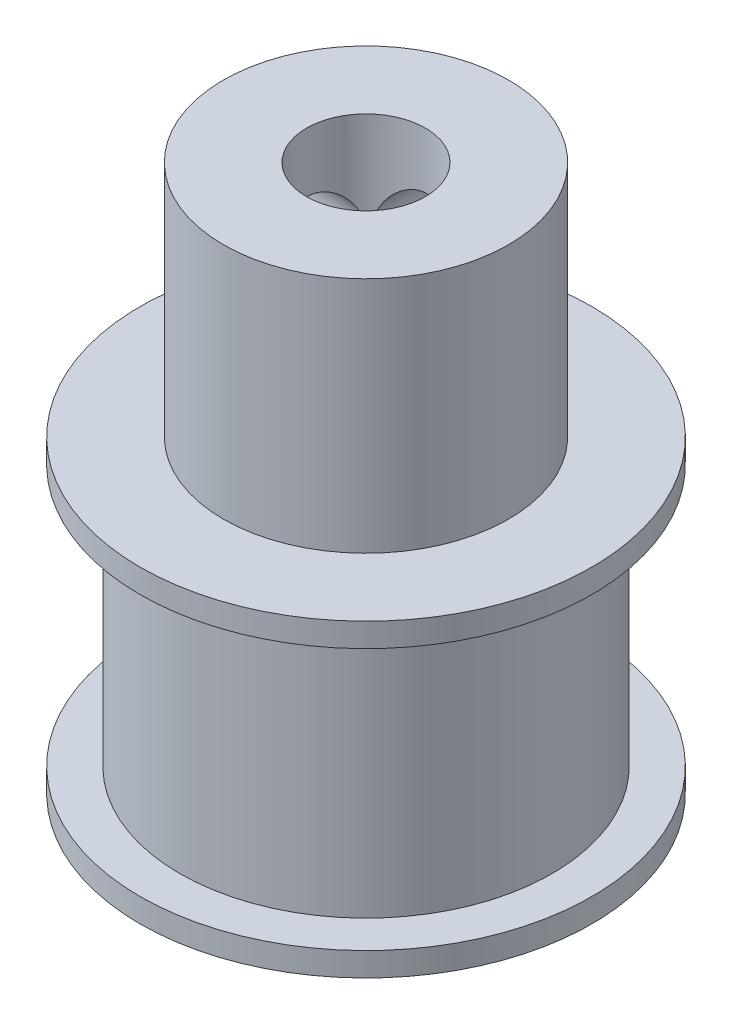
ISO-10303-21;
HEADER;
FILE_DESCRIPTION(('STEP AP214'),'2;1');
FILE_NAME('part.step','',(''),(''),'','','');
FILE_SCHEMA(('AUTOMOTIVE_DESIGN { 1 0 10303 214 1 1 1 1 }'));
ENDSEC;
DATA;
#1=APPLICATION_CONTEXT('core data for automotive mechanical design processes');
#2=APPLICATION_PROTOCOL_DEFINITION('international standard','automotive_design',2000,#1);
#3=PRODUCT_CONTEXT('',#1,'mechanical');
#4=PRODUCT('Part','Part','',(#3));
#5=PRODUCT_RELATED_PRODUCT_CATEGORY('part','',(#4));
#6=PRODUCT_DEFINITION_FORMATION('','',#4);
#7=PRODUCT_DEFINITION_CONTEXT('part definition',#1,'design');
#8=PRODUCT_DEFINITION('design','',#6,#7);
#9=PRODUCT_DEFINITION_SHAPE('','',#8);
#10=(LENGTH_UNIT() NAMED_UNIT(*) SI_UNIT(.MILLI.,.METRE.));
#11=(NAMED_UNIT(*) PLANE_ANGLE_UNIT() SI_UNIT($,.RADIAN.));
#12=(NAMED_UNIT(*) SI_UNIT($,.STERADIAN.) SOLID_ANGLE_UNIT());
#13=UNCERTAINTY_MEASURE_WITH_UNIT(LENGTH_MEASURE(1.E-05),#10,'distance_accuracy_value','');
#14=(GEOMETRIC_REPRESENTATION_CONTEXT(3) GLOBAL_UNCERTAINTY_ASSIGNED_CONTEXT((#13)) GLOBAL_UNIT_ASSIGNED_CONTEXT((#10,
#11,#12)) REPRESENTATION_CONTEXT('',''));
#15=CARTESIAN_POINT('',(0.,0.,0.));
#16=DIRECTION('',(0.,0.,1.));
#17=DIRECTION('',(1.,0.,0.));
#18=AXIS2_PLACEMENT_3D('',#15,#16,#17);
#19=CARTESIAN_POINT('',(0.,1.,0.));
#20=DIRECTION('',(0.,-1.,0.));
#21=DIRECTION('',(0.,0.,-1.));
#22=AXIS2_PLACEMENT_3D('',#19,#20,#21);
#23=CYLINDRICAL_SURFACE('',#22,9.5);
#24=CARTESIAN_POINT('',(0.,1.,0.));
#25=DIRECTION('',(0.,1.,0.));
#26=DIRECTION('',(0.,0.,1.));
#27=AXIS2_PLACEMENT_3D('',#24,#25,#26);
#28=CIRCLE('',#27,9.5);
#29=CARTESIAN_POINT('',(0.,1.,9.5));
#30=VERTEX_POINT('',#29);
#31=EDGE_CURVE('E46',#30,#30,#28,.T.);
#32=ORIENTED_EDGE('',*,*,#31,.F.);
#33=EDGE_LOOP('',(#32));
#34=FACE_BOUND('',#33,.T.);
#35=CARTESIAN_POINT('',(0.,0.,0.));
#36=DIRECTION('',(0.,1.,0.));
#37=DIRECTION('',(0.,0.,1.));
#38=AXIS2_PLACEMENT_3D('',#35,#36,#37);
#39=CIRCLE('',#38,9.5);
#40=CARTESIAN_POINT('',(0.,0.,9.5));
#41=VERTEX_POINT('',#40);
#42=EDGE_CURVE('E37',#41,#41,#39,.T.);
#43=ORIENTED_EDGE('',*,*,#42,.T.);
#44=EDGE_LOOP('',(#43));
#45=FACE_BOUND('',#44,.T.);
#46=ADVANCED_FACE('F34',(#34,#45),#23,.T.);
#47=CARTESIAN_POINT('',(0.,1.,0.));
#48=DIRECTION('',(0.,1.,0.));
#49=DIRECTION('',(0.,0.,1.));
#50=AXIS2_PLACEMENT_3D('',#47,#48,#49);
#51=PLANE('',#50);
#52=CARTESIAN_POINT('',(0.,1.,0.));
#53=DIRECTION('',(0.,1.,0.));
#54=DIRECTION('',(0.,0.,1.));
#55=AXIS2_PLACEMENT_3D('',#52,#53,#54);
#56=CIRCLE('',#55,7.83);
#57=CARTESIAN_POINT('',(0.,1.,7.83));
#58=VERTEX_POINT('',#57);
#59=EDGE_CURVE('E41',#58,#58,#56,.T.);
#60=ORIENTED_EDGE('',*,*,#59,.F.);
#61=EDGE_LOOP('',(#60));
#62=FACE_BOUND('',#61,.T.);
#63=ORIENTED_EDGE('',*,*,#31,.T.);
#64=EDGE_LOOP('',(#63));
#65=FACE_BOUND('',#64,.T.);
#66=ADVANCED_FACE('F70',(#62,#65),#51,.T.);
#67=CARTESIAN_POINT('',(0.,0.,0.));
#68=DIRECTION('',(0.,1.,0.));
#69=DIRECTION('',(0.,0.,1.));
#70=AXIS2_PLACEMENT_3D('',#67,#68,#69);
#71=PLANE('',#70);
#72=CARTESIAN_POINT('',(0.,0.,0.));
#73=DIRECTION('',(0.,1.,0.));
#74=DIRECTION('',(0.,0.,1.));
#75=AXIS2_PLACEMENT_3D('',#72,#73,#74);
#76=CIRCLE('',#75,2.5);
#77=CARTESIAN_POINT('',(0.,0.,2.5));
#78=VERTEX_POINT('',#77);
#79=EDGE_CURVE('E216',#78,#78,#76,.T.);
#80=ORIENTED_EDGE('',*,*,#79,.T.);
#81=EDGE_LOOP('',(#80));
#82=FACE_BOUND('',#81,.T.);
#83=ORIENTED_EDGE('',*,*,#42,.F.);
#84=EDGE_LOOP('',(#83));
#85=FACE_BOUND('',#84,.T.);
#86=ADVANCED_FACE('F67',(#82,#85),#71,.F.);
#87=CARTESIAN_POINT('',(0.,12.,0.));
#88=DIRECTION('',(0.,-1.,0.));
#89=DIRECTION('',(0.,0.,-1.));
#90=AXIS2_PLACEMENT_3D('',#87,#88,#89);
#91=CYLINDRICAL_SURFACE('',#90,7.83);
#92=CARTESIAN_POINT('',(0.,12.,0.));
#93=DIRECTION('',(0.,1.,0.));
#94=DIRECTION('',(0.,0.,1.));
#95=AXIS2_PLACEMENT_3D('',#92,#93,#94);
#96=CIRCLE('',#95,7.83);
#97=CARTESIAN_POINT('',(0.,12.,7.83));
#98=VERTEX_POINT('',#97);
#99=EDGE_CURVE('E55',#98,#98,#96,.T.);
#100=ORIENTED_EDGE('',*,*,#99,.F.);
#101=EDGE_LOOP('',(#100));
#102=FACE_BOUND('',#101,.T.);
#103=ORIENTED_EDGE('',*,*,#59,.T.);
#104=EDGE_LOOP('',(#103));
#105=FACE_BOUND('',#104,.T.);
#106=ADVANCED_FACE('F69',(#102,#105),#91,.T.);
#107=CARTESIAN_POINT('',(0.,13.,0.));
#108=DIRECTION('',(0.,-1.,0.));
#109=DIRECTION('',(0.,0.,-1.));
#110=AXIS2_PLACEMENT_3D('',#107,#108,#109);
#111=CYLINDRICAL_SURFACE('',#110,9.5);
#112=CARTESIAN_POINT('',(0.,13.,0.));
#113=DIRECTION('',(0.,1.,0.));
#114=DIRECTION('',(0.,0.,1.));
#115=AXIS2_PLACEMENT_3D('',#112,#113,#114);
#116=CIRCLE('',#115,9.5);
#117=CARTESIAN_POINT('',(0.,13.,9.5));
#118=VERTEX_POINT('',#117);
#119=EDGE_CURVE('E52',#118,#118,#116,.T.);
#120=ORIENTED_EDGE('',*,*,#119,.F.);
#121=EDGE_LOOP('',(#120));
#122=FACE_BOUND('',#121,.T.);
#123=CARTESIAN_POINT('',(0.,12.,0.));
#124=DIRECTION('',(0.,1.,0.));
#125=DIRECTION('',(0.,0.,1.));
#126=AXIS2_PLACEMENT_3D('',#123,#124,#125);
#127=CIRCLE('',#126,9.5);
#128=CARTESIAN_POINT('',(0.,12.,9.5));
#129=VERTEX_POINT('',#128);
#130=EDGE_CURVE('E56',#129,#129,#127,.T.);
#131=ORIENTED_EDGE('',*,*,#130,.T.);
#132=EDGE_LOOP('',(#131));
#133=FACE_BOUND('',#132,.T.);
#134=ADVANCED_FACE('F76',(#122,#133),#111,.T.);
#135=CARTESIAN_POINT('',(0.,13.,0.));
#136=DIRECTION('',(0.,1.,0.));
#137=DIRECTION('',(0.,0.,1.));
#138=AXIS2_PLACEMENT_3D('',#135,#136,#137);
#139=PLANE('',#138);
#140=CARTESIAN_POINT('',(0.,13.,0.));
#141=DIRECTION('',(0.,1.,0.));
#142=DIRECTION('',(0.,0.,1.));
#143=AXIS2_PLACEMENT_3D('',#140,#141,#142);
#144=CIRCLE('',#143,6.);
#145=CARTESIAN_POINT('',(0.,13.,6.));
#146=VERTEX_POINT('',#145);
#147=EDGE_CURVE('E10',#146,#146,#144,.T.);
#148=ORIENTED_EDGE('',*,*,#147,.F.);
#149=EDGE_LOOP('',(#148));
#150=FACE_BOUND('',#149,.T.);
#151=ORIENTED_EDGE('',*,*,#119,.T.);
#152=EDGE_LOOP('',(#151));
#153=FACE_BOUND('',#152,.T.);
#154=ADVANCED_FACE('F106',(#150,#153),#139,.T.);
#155=CARTESIAN_POINT('',(0.,12.,0.));
#156=DIRECTION('',(0.,1.,0.));
#157=DIRECTION('',(0.,0.,1.));
#158=AXIS2_PLACEMENT_3D('',#155,#156,#157);
#159=PLANE('',#158);
#160=ORIENTED_EDGE('',*,*,#99,.T.);
#161=EDGE_LOOP('',(#160));
#162=FACE_BOUND('',#161,.T.);
#163=ORIENTED_EDGE('',*,*,#130,.F.);
#164=EDGE_LOOP('',(#163));
#165=FACE_BOUND('',#164,.T.);
#166=ADVANCED_FACE('F114',(#162,#165),#159,.F.);
#167=CARTESIAN_POINT('',(0.,23.,0.));
#168=DIRECTION('',(0.,-1.,0.));
#169=DIRECTION('',(0.,0.,-1.));
#170=AXIS2_PLACEMENT_3D('',#167,#168,#169);
#171=CYLINDRICAL_SURFACE('',#170,6.);
#172=CARTESIAN_POINT('',(0.,20.6301819833465,-6.));
#173=CARTESIAN_POINT('',(-0.0911767729636271,20.620837516161,-5.99999862450086));
#174=CARTESIAN_POINT('',(-0.181597990772712,20.6038843136385,-5.99790154128));
#175=CARTESIAN_POINT('',(-0.358274369531179,20.5553382919222,-5.98994805143825));
#176=CARTESIAN_POINT('',(-0.444527075881076,20.523736960519,-5.9840894581938));
#177=CARTESIAN_POINT('',(-0.610327814226774,20.4469728002719,-5.96945734431905));
#178=CARTESIAN_POINT('',(-0.689885862394956,20.4018307095298,-5.96068827899731));
#179=CARTESIAN_POINT('',(-0.840391805564457,20.2992696079768,-5.9413388701896));
#180=CARTESIAN_POINT('',(-0.911339248955944,20.2418499536669,-5.93075843177064));
#181=CARTESIAN_POINT('',(-1.0443669076903,20.1147761176064,-5.90880305097118));
#182=CARTESIAN_POINT('',(-1.10620486360571,20.0448702987881,-5.89741541226102));
#183=CARTESIAN_POINT('',(-1.21733076153562,19.8955786710185,-5.87548491866891));
#184=CARTESIAN_POINT('',(-1.26661811190076,19.8161924154081,-5.86494210362892));
#185=CARTESIAN_POINT('',(-1.35139021913615,19.6495914309898,-5.84599434585058));
#186=CARTESIAN_POINT('',(-1.38680318957688,19.5623387872335,-5.83760059794015));
#187=CARTESIAN_POINT('',(-1.44225072758902,19.3828360606759,-5.82415115549142));
#188=CARTESIAN_POINT('',(-1.46228938245534,19.2905873130865,-5.81909457381031));
#189=CARTESIAN_POINT('',(-1.48585754916021,19.106928373247,-5.81312059691616));
#190=CARTESIAN_POINT('',(-1.48990259315473,19.0155884168568,-5.81207398136034));
#191=CARTESIAN_POINT('',(-1.48275782117429,18.8335533579089,-5.81390082111054));
#192=CARTESIAN_POINT('',(-1.47156956872631,18.7428581901313,-5.81677387410662));
#193=CARTESIAN_POINT('',(-1.43472768553529,18.5664634040446,-5.82596792938268));
#194=CARTESIAN_POINT('',(-1.4093534238253,18.4807015605927,-5.83222226690519));
#195=CARTESIAN_POINT('',(-1.34517238320604,18.3146115686294,-5.84735767355752));
#196=CARTESIAN_POINT('',(-1.30636366373347,18.2342842071161,-5.85623912213793));
#197=CARTESIAN_POINT('',(-1.21533154788017,18.0791624595558,-5.87581330562497));
#198=CARTESIAN_POINT('',(-1.16280058006229,18.0045536670283,-5.88654534956682));
#199=CARTESIAN_POINT('',(-1.04625342139608,17.8649725331209,-5.90837221763611));
#200=CARTESIAN_POINT('',(-0.982234978004602,17.8000020862665,-5.91946711256432));
#201=CARTESIAN_POINT('',(-0.842267701521632,17.6795485031359,-5.94102165357712));
#202=CARTESIAN_POINT('',(-0.766018794540763,17.6244080936774,-5.95145229234943));
#203=CARTESIAN_POINT('',(-0.60510253889407,17.5276656614641,-5.96995812303221));
#204=CARTESIAN_POINT('',(-0.52043576216626,17.4860627197483,-5.97803347482224));
#205=CARTESIAN_POINT('',(-0.345889053139575,17.418043037718,-5.99065409581881));
#206=CARTESIAN_POINT('',(-0.256067052687507,17.3914841701219,-5.99523255038205));
#207=CARTESIAN_POINT('',(-0.073126924642099,17.3538683905214,-6.00025123857152));
#208=CARTESIAN_POINT('',(0.0199904226308959,17.3428078334513,-6.00069244538088));
#209=CARTESIAN_POINT('',(0.203630166213056,17.3366877220476,-5.99722415241113));
#210=CARTESIAN_POINT('',(0.294138662525541,17.3411203455968,-5.99345543531563));
#211=CARTESIAN_POINT('',(0.47295540745249,17.3647090605182,-5.98200141142317));
#212=CARTESIAN_POINT('',(0.561263723248721,17.3838647017578,-5.9743162243684));
#213=CARTESIAN_POINT('',(0.732707000531813,17.4360967721383,-5.95571478723632));
#214=CARTESIAN_POINT('',(0.815869577904955,17.4690898290683,-5.94481800244314));
#215=CARTESIAN_POINT('',(0.975465611562761,17.5479826353296,-5.92072531603867));
#216=CARTESIAN_POINT('',(1.05189796393209,17.5938844968499,-5.90752903830992));
#217=CARTESIAN_POINT('',(1.19827783819547,17.6988422690281,-5.8796128420035));
#218=CARTESIAN_POINT('',(1.26797369471656,17.7582403951918,-5.86485988281339));
#219=CARTESIAN_POINT('',(1.39656778663354,17.8878182838258,-5.83557680554217));
#220=CARTESIAN_POINT('',(1.4554641113788,17.9579999500884,-5.82104672730898));
#221=CARTESIAN_POINT('',(1.5621179287648,18.109047609722,-5.79334953214458));
#222=CARTESIAN_POINT('',(1.60959846293895,18.1901165642271,-5.78021992886271));
#223=CARTESIAN_POINT('',(1.69027776328975,18.3594951219738,-5.75714618730373));
#224=CARTESIAN_POINT('',(1.72347889993195,18.4478035205242,-5.74720152037814));
#225=CARTESIAN_POINT('',(1.77400227681874,18.6273523982865,-5.73180651336771));
#226=CARTESIAN_POINT('',(1.79162316750549,18.7185014058029,-5.7262718545265));
#227=CARTESIAN_POINT('',(1.81145687152056,18.9026154426822,-5.72002947953036));
#228=CARTESIAN_POINT('',(1.81367317027408,18.9955800564742,-5.71932067148474));
#229=CARTESIAN_POINT('',(1.80280626421198,19.1774834197769,-5.72275418004724));
#230=CARTESIAN_POINT('',(1.79021564012806,19.2664551215283,-5.72674031685868));
#231=CARTESIAN_POINT('',(1.75097153069946,19.4409414917706,-5.7388601227847));
#232=CARTESIAN_POINT('',(1.72431724443373,19.5264559630746,-5.74699402811249));
#233=CARTESIAN_POINT('',(1.65755765538125,19.6922968548768,-5.76660324252605));
#234=CARTESIAN_POINT('',(1.61736532332923,19.7725855918049,-5.77810010578938));
#235=CARTESIAN_POINT('',(1.52470176184769,19.9253643887062,-5.80323895466779));
#236=CARTESIAN_POINT('',(1.47222815646321,19.997852935676,-5.81688135519423));
#237=CARTESIAN_POINT('',(1.35429542810486,20.1356554829769,-5.84548410780753));
#238=CARTESIAN_POINT('',(1.2884466151692,20.2006302631555,-5.86047385583648));
#239=CARTESIAN_POINT('',(1.14667535462093,20.318660393753,-5.88985299023171));
#240=CARTESIAN_POINT('',(1.07075118775885,20.3717137057326,-5.90424227358316));
#241=CARTESIAN_POINT('',(0.909949229643914,20.4648658435635,-5.93116335543589));
#242=CARTESIAN_POINT('',(0.824987543881932,20.5048261285294,-5.94367457481583));
#243=CARTESIAN_POINT('',(0.649149281361857,20.5697198093998,-5.96543625081545));
#244=CARTESIAN_POINT('',(0.55827695588597,20.5946638762774,-5.97468902104125));
#245=CARTESIAN_POINT('',(0.38927411551167,20.6257460436327,-5.98785232412913));
#246=CARTESIAN_POINT('',(0.311644082651371,20.6343828687105,-5.99240841926791));
#247=CARTESIAN_POINT('',(0.155826726701991,20.6405790321267,-5.99848275039037));
#248=CARTESIAN_POINT('',(0.0776394378232258,20.638139044728,-6.00000117127396));
#249=CARTESIAN_POINT('',(0.,20.6301819833465,-6.));
#250=B_SPLINE_CURVE_WITH_KNOTS('',3,(#172,#173,#174,#175,#176,#177,#178,#179,#180,#181,#182,
#183,#184,#185,#186,#187,#188,#189,#190,#191,#192,#193,#194,#195,#196,#197,#198,#199,#200,#201,
#202,#203,#204,#205,#206,#207,#208,#209,#210,#211,#212,#213,#214,#215,#216,#217,#218,#219,#220,
#221,#222,#223,#224,#225,#226,#227,#228,#229,#230,#231,#232,#233,#234,#235,#236,#237,#238,#239,
#240,#241,#242,#243,#244,#245,#246,#247,#248,#249),.UNSPECIFIED.,.T.,.F.,(4,2,2,2,2,2,2,2,2,2,2,
2,2,2,2,2,2,2,2,2,2,2,2,2,2,2,2,2,2,2,2,2,2,2,2,2,2,2,4),(0.,0.274672979110037,
0.549505774586879,0.823919785588654,1.09834818286907,1.37910611701783,1.65987728395548,
1.94208256707264,2.22421279928586,2.49717100042524,2.77010118757969,3.03783675887706,
3.30561101984676,3.57999710958137,3.85443706173775,4.13710270948336,4.4197491650939,
4.69967879876516,4.97954258440227,5.2503204617167,5.52109006076203,5.79025115728031,
6.05945632063498,6.33645179969997,6.61349623755637,6.89670415085918,7.17986503178793,
7.45747248969806,7.73501713441954,8.003583920446,8.27216600291596,8.5425087051839,
8.8129037516824,9.09274744408554,9.37263895031986,9.65540300168123,9.93796587452869,
10.1718714314569,10.405762750377),.UNSPECIFIED.);
#251=CARTESIAN_POINT('',(0.,20.6301819833465,-6.));
#252=VERTEX_POINT('',#251);
#253=EDGE_CURVE('E198',#252,#252,#250,.T.);
#254=ORIENTED_EDGE('',*,*,#253,.T.);
#255=EDGE_LOOP('',(#254));
#256=FACE_BOUND('',#255,.T.);
#257=CARTESIAN_POINT('',(-5.84283231595858,18.8334761657231,1.36429854782231));
#258=CARTESIAN_POINT('',(-5.84283367618818,18.7426957190814,1.36429651591172));
#259=CARTESIAN_POINT('',(-5.84462631345508,18.6518949351074,1.3566836853668));
#260=CARTESIAN_POINT('',(-5.85154814083179,18.4729234580005,1.32650529935623));
#261=CARTESIAN_POINT('',(-5.85667886742528,18.3847539955898,1.30393285806648));
#262=CARTESIAN_POINT('',(-5.8695585320605,18.2136603785349,1.24466606570195));
#263=CARTESIAN_POINT('',(-5.8773036273039,18.1307287361196,1.20799243069407));
#264=CARTESIAN_POINT('',(-5.89438601800649,17.9721089475682,1.12166911003332));
#265=CARTESIAN_POINT('',(-5.90372346560178,17.8964214946343,1.0720181842659));
#266=CARTESIAN_POINT('',(-5.92301642208846,17.7524257034059,0.959785217779206));
#267=CARTESIAN_POINT('',(-5.93298139369016,17.6843385544951,0.896920955674683));
#268=CARTESIAN_POINT('',(-5.95197747004505,17.5594349639641,0.760713746800108));
#269=CARTESIAN_POINT('',(-5.96100847267227,17.5026197542652,0.687369656184455));
#270=CARTESIAN_POINT('',(-5.97700250138005,17.4009413619501,0.530782808800627));
#271=CARTESIAN_POINT('',(-5.98392748034313,17.356299429344,0.447392094727171));
#272=CARTESIAN_POINT('',(-5.99436397115927,17.2816800269484,0.274088264804776));
#273=CARTESIAN_POINT('',(-5.99787609674641,17.2516999210015,0.184176324795538));
#274=CARTESIAN_POINT('',(-6.00066843524779,17.2079749210405,0.00273061586605571));
#275=CARTESIAN_POINT('',(-6.0000493450816,17.1938534497064,-0.0887107459138302));
#276=CARTESIAN_POINT('',(-5.99451206527872,17.1810603670434,-0.272532351301434));
#277=CARTESIAN_POINT('',(-5.98959463922556,17.1823860121069,-0.36491242526959));
#278=CARTESIAN_POINT('',(-5.97583010748287,17.200187312114,-0.545371191962911));
#279=CARTESIAN_POINT('',(-5.96709187691199,17.2162558937064,-0.633498806324556));
#280=CARTESIAN_POINT('',(-5.94630585808424,17.2624275503162,-0.805582292590418));
#281=CARTESIAN_POINT('',(-5.93425787536135,17.2925314500577,-0.889537919025166));
#282=CARTESIAN_POINT('',(-5.9076450947981,17.3662223112698,-1.05193958677669));
#283=CARTESIAN_POINT('',(-5.89305547361465,17.409945965837,-1.13031940275437));
#284=CARTESIAN_POINT('',(-5.86265327049509,17.5095295573697,-1.27868701656677));
#285=CARTESIAN_POINT('',(-5.84684043767356,17.5653919883182,-1.34867308526431));
#286=CARTESIAN_POINT('',(-5.81482953539839,17.6898167770424,-1.48071882616018));
#287=CARTESIAN_POINT('',(-5.79863570729032,17.7587337113106,-1.54244581976323));
#288=CARTESIAN_POINT('',(-5.76792133531382,17.9061965876401,-1.65360771279139));
#289=CARTESIAN_POINT('',(-5.7534009073529,17.9847431959207,-1.703041761024));
#290=CARTESIAN_POINT('',(-5.72740389130101,18.1499932426422,-1.78853687896934));
#291=CARTESIAN_POINT('',(-5.71594905638418,18.2367493529869,-1.82450306440392));
#292=CARTESIAN_POINT('',(-5.69746993275193,18.4154977806279,-1.88142016761068));
#293=CARTESIAN_POINT('',(-5.69044446452216,18.5074886968061,-1.90237508299859));
#294=CARTESIAN_POINT('',(-5.68176990535243,18.6909725765182,-1.92812624539078));
#295=CARTESIAN_POINT('',(-5.67995756261582,18.7823890136588,-1.9334133052732));
#296=CARTESIAN_POINT('',(-5.68144371388677,18.964814696123,-1.92904200633784));
#297=CARTESIAN_POINT('',(-5.68474162437066,19.0558239867473,-1.91938535389554));
#298=CARTESIAN_POINT('',(-5.69596112930281,19.2328950443984,-1.88582230055918));
#299=CARTESIAN_POINT('',(-5.70378527418643,19.319020309001,-1.86221601106643));
#300=CARTESIAN_POINT('',(-5.7231762853817,19.4860278489386,-1.80173670757512));
#301=CARTESIAN_POINT('',(-5.73474366297283,19.5669094062353,-1.76486188118081));
#302=CARTESIAN_POINT('',(-5.76080275150937,19.7232042599032,-1.67787153247394));
#303=CARTESIAN_POINT('',(-5.77535603825252,19.7984473238445,-1.62746887976595));
#304=CARTESIAN_POINT('',(-5.80583237934673,19.939480528323,-1.51515340656867));
#305=CARTESIAN_POINT('',(-5.82175570778131,20.0052687703146,-1.45323828006295));
#306=CARTESIAN_POINT('',(-5.85403290247317,20.1276195207606,-1.3173147842623));
#307=CARTESIAN_POINT('',(-5.87038482737583,20.1838331507303,-1.24299123697883));
#308=CARTESIAN_POINT('',(-5.90151695861642,20.2828691961656,-1.08559810927949));
#309=CARTESIAN_POINT('',(-5.91629724842577,20.3256923230516,-1.00252899381801));
#310=CARTESIAN_POINT('',(-5.94287009962105,20.3963305790363,-0.830542302921581));
#311=CARTESIAN_POINT('',(-5.95468481633851,20.4242588666589,-0.74167475332684));
#312=CARTESIAN_POINT('',(-5.97449870073596,20.4646356826914,-0.560085832211164));
#313=CARTESIAN_POINT('',(-5.98249877168788,20.4770878768165,-0.467365378680167));
#314=CARTESIAN_POINT('',(-5.99395981756808,20.4859173561347,-0.283932572219289));
#315=CARTESIAN_POINT('',(-5.99756011965388,20.4828048979866,-0.193253148998172));
#316=CARTESIAN_POINT('',(-6.00065757541013,20.4617865839133,-0.0135611205478293));
#317=CARTESIAN_POINT('',(-6.00015490090782,20.4438813475183,0.0754515543261436));
#318=CARTESIAN_POINT('',(-5.99546872008123,20.3940814048346,0.248607506300531));
#319=CARTESIAN_POINT('',(-5.99131372521762,20.3622960176326,0.332783132155014));
#320=CARTESIAN_POINT('',(-5.98011552255743,20.2857353330913,0.494792706867527));
#321=CARTESIAN_POINT('',(-5.97307189053186,20.2409581280396,0.572625722228129));
#322=CARTESIAN_POINT('',(-5.95688103265632,20.1382241297367,0.722066472568171));
#323=CARTESIAN_POINT('',(-5.9476804064644,20.0799332764598,0.79343874283834));
#324=CARTESIAN_POINT('',(-5.92855365760995,19.9524524392834,0.925591350128466));
#325=CARTESIAN_POINT('',(-5.91862734062935,19.883259530371,0.986368835331326));
#326=CARTESIAN_POINT('',(-5.89913919757429,19.7339583605226,1.09699290768467));
#327=CARTESIAN_POINT('',(-5.88959166963214,19.653629502506,1.14654490298854));
#328=CARTESIAN_POINT('',(-5.87246657637435,19.4855505597042,1.23126624137537));
#329=CARTESIAN_POINT('',(-5.86488780211705,19.397805073295,1.26644441854974));
#330=CARTESIAN_POINT('',(-5.85369874410927,19.2309798335208,1.31710898751965));
#331=CARTESIAN_POINT('',(-5.84966319009149,19.1525799177043,1.33476043761754));
#332=CARTESIAN_POINT('',(-5.84422954831953,18.9939505253786,1.35835534568148));
#333=CARTESIAN_POINT('',(-5.84283111358739,18.9137212909675,1.36430034392407));
#334=CARTESIAN_POINT('',(-5.84283231595858,18.8334761657231,1.36429854782231));
#335=B_SPLINE_CURVE_WITH_KNOTS('',3,(#257,#258,#259,#260,#261,#262,#263,#264,#265,#266,#267,
#268,#269,#270,#271,#272,#273,#274,#275,#276,#277,#278,#279,#280,#281,#282,#283,#284,#285,#286,
#287,#288,#289,#290,#291,#292,#293,#294,#295,#296,#297,#298,#299,#300,#301,#302,#303,#304,#305,
#306,#307,#308,#309,#310,#311,#312,#313,#314,#315,#316,#317,#318,#319,#320,#321,#322,#323,#324,
#325,#326,#327,#328,#329,#330,#331,#332,#333,#334),.UNSPECIFIED.,.T.,.F.,(4,2,2,2,2,2,2,2,2,2,2,
2,2,2,2,2,2,2,2,2,2,2,2,2,2,2,2,2,2,2,2,2,2,2,2,2,2,2,4),(0.,0.272046051104012,
0.544217410515629,0.815990441281185,1.08778945227587,1.36612384486572,1.64448864015853,
1.92761862185042,2.21069767879603,2.48690242321262,2.76305811084345,3.03181099442101,
3.30057967207718,3.57213780160766,3.84375177719015,4.12421818647043,4.40470401050125,
4.68713031851457,4.9694813862591,5.24288876991941,5.5162649363549,5.78396348444837,
6.0516986123097,6.32564040616628,6.59963713140791,6.88212071608134,7.16458929021235,
7.44488018041166,7.72510466738726,7.9962039644357,8.26729190826139,8.53628224078239,
8.80531209172669,9.08187822938626,9.35851869627827,9.6417433998802,9.92479377192828,
10.1652997746179,10.4057741306125),.UNSPECIFIED.);
#336=CARTESIAN_POINT('',(-5.84283231595858,18.8334761657231,1.36429854782231));
#337=VERTEX_POINT('',#336);
#338=EDGE_CURVE('E210',#337,#337,#335,.T.);
#339=ORIENTED_EDGE('',*,*,#338,.T.);
#340=EDGE_LOOP('',(#339));
#341=FACE_BOUND('',#340,.T.);
#342=CARTESIAN_POINT('',(0.,23.,0.));
#343=DIRECTION('',(0.,1.,0.));
#344=DIRECTION('',(0.,0.,1.));
#345=AXIS2_PLACEMENT_3D('',#342,#343,#344);
#346=CIRCLE('',#345,6.);
#347=CARTESIAN_POINT('',(0.,23.,6.));
#348=VERTEX_POINT('',#347);
#349=EDGE_CURVE('E50',#348,#348,#346,.T.);
#350=ORIENTED_EDGE('',*,*,#349,.F.);
#351=EDGE_LOOP('',(#350));
#352=FACE_BOUND('',#351,.T.);
#353=ORIENTED_EDGE('',*,*,#147,.T.);
#354=EDGE_LOOP('',(#353));
#355=FACE_BOUND('',#354,.T.);
#356=ADVANCED_FACE('F119',(#256,#341,#352,#355),#171,.T.);
#357=CARTESIAN_POINT('',(0.,23.,0.));
#358=DIRECTION('',(0.,1.,0.));
#359=DIRECTION('',(0.,0.,1.));
#360=AXIS2_PLACEMENT_3D('',#357,#358,#359);
#361=PLANE('',#360);
#362=CARTESIAN_POINT('',(0.,23.,0.));
#363=DIRECTION('',(0.,1.,0.));
#364=DIRECTION('',(0.,0.,1.));
#365=AXIS2_PLACEMENT_3D('',#362,#363,#364);
#366=CIRCLE('',#365,2.5);
#367=CARTESIAN_POINT('',(0.,23.,2.5));
#368=VERTEX_POINT('',#367);
#369=EDGE_CURVE('E215',#368,#368,#366,.T.);
#370=ORIENTED_EDGE('',*,*,#369,.F.);
#371=EDGE_LOOP('',(#370));
#372=FACE_BOUND('',#371,.T.);
#373=ORIENTED_EDGE('',*,*,#349,.T.);
#374=EDGE_LOOP('',(#373));
#375=FACE_BOUND('',#374,.T.);
#376=ADVANCED_FACE('F137',(#372,#375),#361,.T.);
#377=CARTESIAN_POINT('',(0.,0.,0.));
#378=DIRECTION('',(0.,1.,0.));
#379=DIRECTION('',(0.,0.,1.));
#380=AXIS2_PLACEMENT_3D('',#377,#378,#379);
#381=CYLINDRICAL_SURFACE('',#380,2.5);
#382=CARTESIAN_POINT('',(-1.59668478918975,18.9887824422168,-1.92369376044371));
#383=CARTESIAN_POINT('',(-1.59667895373649,19.0695767187765,-1.92370317081926));
#384=CARTESIAN_POINT('',(-1.59055273152686,19.1504088112726,-1.92883401596511));
#385=CARTESIAN_POINT('',(-1.56657008294365,19.3092003928221,-1.94835252366168));
#386=CARTESIAN_POINT('',(-1.5486925947672,19.3871544581327,-1.96275680604541));
#387=CARTESIAN_POINT('',(-1.50263503786641,19.537415773799,-1.99822791281291));
#388=CARTESIAN_POINT('',(-1.47455252312807,19.609768873722,-2.01923140346138));
#389=CARTESIAN_POINT('',(-1.40921370611543,19.7487276895976,-2.06536066116545));
#390=CARTESIAN_POINT('',(-1.3719553961958,19.8153321434453,-2.09048732996203));
#391=CARTESIAN_POINT('',(-1.28279620026727,19.9519998090936,-2.14653379913367));
#392=CARTESIAN_POINT('',(-1.22953041838521,20.0210497187268,-2.17775360651913));
#393=CARTESIAN_POINT('',(-1.11277561447846,20.1502595883607,-2.2396667356343));
#394=CARTESIAN_POINT('',(-1.04927693060445,20.2104110425135,-2.27035952915156));
#395=CARTESIAN_POINT('',(-0.903178281725033,20.3285151584157,-2.3326856701172));
#396=CARTESIAN_POINT('',(-0.819148189818825,20.3849733458545,-2.36384603046538));
#397=CARTESIAN_POINT('',(-0.640345452803766,20.4826235965033,-2.41840013362841));
#398=CARTESIAN_POINT('',(-0.5455847163104,20.5238323704596,-2.44180237506567));
#399=CARTESIAN_POINT('',(-0.359085004741253,20.5848560544835,-2.4756863185182));
#400=CARTESIAN_POINT('',(-0.268168848654864,20.6065315917062,-2.48730985079045));
#401=CARTESIAN_POINT('',(-0.0833009117673833,20.6342725893333,-2.50032176101177));
#402=CARTESIAN_POINT('',(0.0106470112592685,20.6403571524605,-2.50172266804945));
#403=CARTESIAN_POINT('',(0.183734665061579,20.6367910668377,-2.49451605504825));
#404=CARTESIAN_POINT('',(0.262993283534873,20.6293517743036,-2.48736999327935));
#405=CARTESIAN_POINT('',(0.418651602366162,20.603319366795,-2.46594811172702));
#406=CARTESIAN_POINT('',(0.495051091821595,20.5847254307186,-2.45167176709095));
#407=CARTESIAN_POINT('',(0.642894531253384,20.5373677263441,-2.41711450395084));
#408=CARTESIAN_POINT('',(0.714351797465234,20.5086326694452,-2.39685056353564));
#409=CARTESIAN_POINT('',(0.851296818136746,20.442100338145,-2.35170125943634));
#410=CARTESIAN_POINT('',(0.916783442344458,20.4043013528237,-2.32681502344127));
#411=CARTESIAN_POINT('',(1.04912747668603,20.3152306338519,-2.27049627991255));
#412=CARTESIAN_POINT('',(1.11504987400038,20.2628447435956,-2.23863330733648));
#413=CARTESIAN_POINT('',(1.23768711658329,20.1489726699752,-2.17324029598978));
#414=CARTESIAN_POINT('',(1.2943875344393,20.087472509551,-2.13970775026252));
#415=CARTESIAN_POINT('',(1.40580590483592,19.946289344791,-2.06850311529047));
#416=CARTESIAN_POINT('',(1.4589250067673,19.8652631397917,-2.03097262332433));
#417=CARTESIAN_POINT('',(1.55086993527023,19.6932526650521,-1.96166239485673));
#418=CARTESIAN_POINT('',(1.58972032759731,19.6022858633583,-1.92987282292132));
#419=CARTESIAN_POINT('',(1.64256708799151,19.4388314540164,-1.8848933745894));
#420=CARTESIAN_POINT('',(1.66048263987955,19.3683655041575,-1.86898644361619));
#421=CARTESIAN_POINT('',(1.68711473353296,19.2244672804577,-1.84498606522134));
#422=CARTESIAN_POINT('',(1.69584667714016,19.1510401882477,-1.83687953768215));
#423=CARTESIAN_POINT('',(1.7035884289112,19.0029214232521,-1.82970484052702));
#424=CARTESIAN_POINT('',(1.70255965572139,18.9282258980371,-1.83067253858342));
#425=CARTESIAN_POINT('',(1.69076023645979,18.7802491500696,-1.84157202000062));
#426=CARTESIAN_POINT('',(1.67998156619054,18.7069691430389,-1.8515111868956));
#427=CARTESIAN_POINT('',(1.65002397188496,18.5669385121643,-1.87824280332239));
#428=CARTESIAN_POINT('',(1.6312270628674,18.5000425989149,-1.89472146160963));
#429=CARTESIAN_POINT('',(1.58609534072321,18.3703706525232,-1.93265839468119));
#430=CARTESIAN_POINT('',(1.55975802797883,18.3075959940597,-1.95411832029121));
#431=CARTESIAN_POINT('',(1.49424895132653,18.174628975928,-2.00480775731465));
#432=CARTESIAN_POINT('',(1.45356580993205,18.1054487198346,-2.03473348104102));
#433=CARTESIAN_POINT('',(1.36302579630216,17.9742364458004,-2.09646631521701));
#434=CARTESIAN_POINT('',(1.31315776190212,17.9122132764866,-2.12827568254778));
#435=CARTESIAN_POINT('',(1.19343159682318,17.7838052353112,-2.19805989702854));
#436=CARTESIAN_POINT('',(1.12157353757915,17.7192106979115,-2.23593627841606));
#437=CARTESIAN_POINT('',(0.96611077977832,17.6030753870585,-2.30736364834808));
#438=CARTESIAN_POINT('',(0.882517296888429,17.5515222800672,-2.3409187087926));
#439=CARTESIAN_POINT('',(0.722452316991735,17.472245404185,-2.39452231881535));
#440=CARTESIAN_POINT('',(0.647767757989632,17.4418356483815,-2.41592865829431));
#441=CARTESIAN_POINT('',(0.493261039517441,17.3921901422597,-2.45213597875242));
#442=CARTESIAN_POINT('',(0.413443244472778,17.3729450353839,-2.46694248831476));
#443=CARTESIAN_POINT('',(0.250419719705409,17.3465902340954,-2.48879015573447));
#444=CARTESIAN_POINT('',(0.167201398779494,17.3395308092,-2.49579910433303));
#445=CARTESIAN_POINT('',(0.000372403229287392,17.338147659475,-2.5013920088034));
#446=CARTESIAN_POINT('',(-0.0832382533668573,17.3438233550656,-2.4999763480773));
#447=CARTESIAN_POINT('',(-0.242537864657401,17.3667419239701,-2.4894022756539));
#448=CARTESIAN_POINT('',(-0.31838127752214,17.3831807101902,-2.4807713045935));
#449=CARTESIAN_POINT('',(-0.466168300288907,17.4260086057417,-2.45729329214929));
#450=CARTESIAN_POINT('',(-0.538111295299078,17.4523992787781,-2.44244527386225));
#451=CARTESIAN_POINT('',(-0.681082092630777,17.5160394094054,-2.40663586805096));
#452=CARTESIAN_POINT('',(-0.751769114628915,17.5538663953976,-2.38534930086207));
#453=CARTESIAN_POINT('',(-0.886166199390949,17.6383900263587,-2.33875568511801));
#454=CARTESIAN_POINT('',(-0.949871711504959,17.6850924028564,-2.31344604028654));
#455=CARTESIAN_POINT('',(-1.07901371650788,17.7943115173694,-2.25642570624471));
#456=CARTESIAN_POINT('',(-1.1431563991287,17.8581596439642,-2.22433351387328));
#457=CARTESIAN_POINT('',(-1.26039202426596,17.9953507826583,-2.16006553021151));
#458=CARTESIAN_POINT('',(-1.31347778720476,18.0686999142182,-2.12788969825336));
#459=CARTESIAN_POINT('',(-1.40304927809158,18.2167556441994,-2.06978925250414));
#460=CARTESIAN_POINT('',(-1.44063030202664,18.2906773999813,-2.04356122000155));
#461=CARTESIAN_POINT('',(-1.50458569449405,18.4448915751001,-1.99694650730319));
#462=CARTESIAN_POINT('',(-1.53098397320873,18.5251699621099,-1.97654739483748));
#463=CARTESIAN_POINT('',(-1.56601504550108,18.6694738390305,-1.94883638462958));
#464=CARTESIAN_POINT('',(-1.57746050577655,18.7324293498237,-1.93951431337351));
#465=CARTESIAN_POINT('',(-1.59279567263886,18.8598432440392,-1.92694087998194));
#466=CARTESIAN_POINT('',(-1.59668944644554,18.924300799541,-1.92368625005438));
#467=CARTESIAN_POINT('',(-1.59668478918975,18.9887824422168,-1.92369376044371));
#468=B_SPLINE_CURVE_WITH_KNOTS('',3,(#382,#383,#384,#385,#386,#387,#388,#389,#390,#391,#392,
#393,#394,#395,#396,#397,#398,#399,#400,#401,#402,#403,#404,#405,#406,#407,#408,#409,#410,#411,
#412,#413,#414,#415,#416,#417,#418,#419,#420,#421,#422,#423,#424,#425,#426,#427,#428,#429,#430,
#431,#432,#433,#434,#435,#436,#437,#438,#439,#440,#441,#442,#443,#444,#445,#446,#447,#448,#449,
#450,#451,#452,#453,#454,#455,#456,#457,#458,#459,#460,#461,#462,#463,#464,#465,#466,#467),
.UNSPECIFIED.,.T.,.F.,(4,2,2,2,2,2,2,2,2,2,2,2,2,2,2,2,2,2,2,2,2,2,2,2,2,2,2,2,2,2,2,2,2,2,2,2,
2,2,2,2,2,2,4),(0.,0.242089089232207,0.484613262365224,0.72487754222912,0.965194438206265,
1.24204242334406,1.5191533550871,1.83517136959404,2.1508420497088,2.43163690958526,
2.71208756281942,2.95071293244789,3.18935586962917,3.42732851395789,3.66534611375403,
3.93440451568683,4.20387988176699,4.51414003592554,4.82386349786489,5.04625677123859,
5.26827647088753,5.49117411610793,5.71425537389903,5.92772322794785,6.14126192794925,
6.39732261532282,6.65369656488883,6.96356575078111,7.27314078239637,7.5223841368641,
7.77141830954322,8.02147738775786,8.27152508592673,8.50474641601317,8.73800440662635,
8.98590102363145,9.23395827408609,9.52089661145362,9.80802068929722,10.067982581361,
10.327385800336,10.5207004402689,10.713910935025),.UNSPECIFIED.);
#469=CARTESIAN_POINT('',(-1.59668478918975,18.9887824422168,-1.92369376044371));
#470=VERTEX_POINT('',#469);
#471=EDGE_CURVE('E194',#470,#470,#468,.T.);
#472=ORIENTED_EDGE('',*,*,#471,.T.);
#473=EDGE_LOOP('',(#472));
#474=FACE_BOUND('',#473,.T.);
#475=CARTESIAN_POINT('',(-1.95703879011479,18.8334761657231,1.55563465311944));
#476=CARTESIAN_POINT('',(-1.95704807494439,18.9142704422829,1.55562861990951));
#477=CARTESIAN_POINT('',(-1.96204818095195,18.9951025347789,1.54939523315866));
#478=CARTESIAN_POINT('',(-1.98105500415677,19.1538941163284,1.52500506613531));
#479=CARTESIAN_POINT('',(-1.99507789193727,19.231848181639,1.50682687720503));
#480=CARTESIAN_POINT('',(-2.02956678301931,19.3821094973054,1.46002928800524));
#481=CARTESIAN_POINT('',(-2.04997153036563,19.4544625972284,1.43150875962335));
#482=CARTESIAN_POINT('',(-2.09470832132326,19.5934214131039,1.36520876746835));
#483=CARTESIAN_POINT('',(-2.11904122400505,19.6600258669516,1.32742727742416));
#484=CARTESIAN_POINT('',(-2.17318912289999,19.7966935325999,1.23710245264995));
#485=CARTESIAN_POINT('',(-2.20327518666524,19.8657434422332,1.18318818125725));
#486=CARTESIAN_POINT('',(-2.26270468900797,19.994953311867,1.06514982290103));
#487=CARTESIAN_POINT('',(-2.29204739510923,20.0551047660198,1.00101608742367));
#488=CARTESIAN_POINT('',(-2.35126909178091,20.173208881922,0.853631713437187));
#489=CARTESIAN_POINT('',(-2.38064494889354,20.2296670693608,0.768961273366921));
#490=CARTESIAN_POINT('',(-2.43140454081781,20.3273173200097,0.589044534946951));
#491=CARTESIAN_POINT('',(-2.45279702425915,20.3685260939659,0.493809962772423));
#492=CARTESIAN_POINT('',(-2.48272826366307,20.4295497779898,0.306635218356903));
#493=CARTESIAN_POINT('',(-2.49242599989004,20.4512253152126,0.215493527281518));
#494=CARTESIAN_POINT('',(-2.50152439414695,20.4789663128397,0.0303917090338644));
#495=CARTESIAN_POINT('',(-2.50093766006744,20.4850508759669,-0.0635648262612921));
#496=CARTESIAN_POINT('',(-2.49007124945699,20.4814847903441,-0.236461304797389));
#497=CARTESIAN_POINT('',(-2.48125018928834,20.47404549781,-0.315551024095166));
#498=CARTESIAN_POINT('',(-2.45654038242612,20.4480130903013,-0.470721364932121));
#499=CARTESIAN_POINT('',(-2.44065111545866,20.4294191542249,-0.546801764513455));
#500=CARTESIAN_POINT('',(-2.40297417825955,20.3820614498505,-0.693881115280483));
#501=CARTESIAN_POINT('',(-2.38120320063269,20.3533263929515,-0.764893738868074));
#502=CARTESIAN_POINT('',(-2.33316713228484,20.2867940616513,-0.900853050741342));
#503=CARTESIAN_POINT('',(-2.30690119335684,20.24899507633,-0.965798590575543));
#504=CARTESIAN_POINT('',(-2.24779551183458,20.1599243573582,-1.09692167286941));
#505=CARTESIAN_POINT('',(-2.21454517931517,20.1075384671019,-1.16215530588492));
#506=CARTESIAN_POINT('',(-2.14657259308281,19.9936663934815,-1.28338181586609));
#507=CARTESIAN_POINT('',(-2.11184813816451,19.9321662330574,-1.33936021561656));
#508=CARTESIAN_POINT('',(-2.03830254716171,19.7909830682974,-1.44924742755404));
#509=CARTESIAN_POINT('',(-1.9996567979628,19.709956863298,-1.50156074216964));
#510=CARTESIAN_POINT('',(-1.92841712107832,19.5379463885585,-1.59201894293131));
#511=CARTESIAN_POINT('',(-1.89581284050783,19.4469795868646,-1.63018818128216));
#512=CARTESIAN_POINT('',(-1.84972556270185,19.2835251775227,-1.68207164378074));
#513=CARTESIAN_POINT('',(-1.83344321439303,19.2130592276639,-1.69964669956983));
#514=CARTESIAN_POINT('',(-1.80888484426503,19.0691610039641,-1.72576514194522));
#515=CARTESIAN_POINT('',(-1.80059541945222,18.9957339117541,-1.73432365023671));
#516=CARTESIAN_POINT('',(-1.7932585625425,18.8476151467584,-1.74191189973436));
#517=CARTESIAN_POINT('',(-1.79424780622294,18.7729196215434,-1.74090382694673));
#518=CARTESIAN_POINT('',(-1.8053944478161,18.624942873576,-1.72933761013793));
#519=CARTESIAN_POINT('',(-1.81555939735074,18.5516628665452,-1.71877159990239));
#520=CARTESIAN_POINT('',(-1.84291874035508,18.4116322356706,-1.68938617624136));
#521=CARTESIAN_POINT('',(-1.85979133183849,18.3447363224212,-1.67094205457088));
#522=CARTESIAN_POINT('',(-1.89867447013698,18.2150643760296,-1.62662293013642));
#523=CARTESIAN_POINT('',(-1.92068672028405,18.1522897175661,-1.60074546323476));
#524=CARTESIAN_POINT('',(-1.97275056145434,18.0193226994343,-1.53632330406429));
#525=CARTESIAN_POINT('',(-2.00353017993364,17.9501424433409,-1.4962822998244));
#526=CARTESIAN_POINT('',(-2.06716443917643,17.8189301693067,-1.4070684111404));
#527=CARTESIAN_POINT('',(-2.10002157243493,17.756906999993,-1.35788441477024));
#528=CARTESIAN_POINT('',(-2.17232279973806,17.6284989588176,-1.23966122023689));
#529=CARTESIAN_POINT('',(-2.21171075554737,17.5639044214179,-1.16862045811757));
#530=CARTESIAN_POINT('',(-2.28641072474172,17.4477691105649,-1.01470342578908));
#531=CARTESIAN_POINT('',(-2.32172657186499,17.3962160035736,-0.931838454872151));
#532=CARTESIAN_POINT('',(-2.37870412251908,17.3169391276914,-0.772943195288171));
#533=CARTESIAN_POINT('',(-2.40168551213302,17.2865293718879,-0.698728166792327));
#534=CARTESIAN_POINT('',(-2.44115308912432,17.236883865766,-0.54502193245475));
#535=CARTESIAN_POINT('',(-2.45764471152489,17.2176387588903,-0.465535207010759));
#536=CARTESIAN_POINT('',(-2.48293600888464,17.1912839576018,-0.303010315141483));
#537=CARTESIAN_POINT('',(-2.49170374814023,17.1842245327064,-0.219958878991757));
#538=CARTESIAN_POINT('',(-2.50082441875922,17.1828413829814,-0.0532855226801804));
#539=CARTESIAN_POINT('',(-2.50117773305756,17.1885170785719,0.0303363713472604));
#540=CARTESIAN_POINT('',(-2.49397577146081,17.2114356474764,0.18982401636747));
#541=CARTESIAN_POINT('',(-2.48695108551362,17.2278744336966,0.26583303375199));
#542=CARTESIAN_POINT('',(-2.46660453971331,17.2707023292481,0.414083629840475));
#543=CARTESIAN_POINT('',(-2.45328169016842,17.2970930022844,0.486324614455097));
#544=CARTESIAN_POINT('',(-2.42050463024014,17.3607331329118,0.630020914952633));
#545=CARTESIAN_POINT('',(-2.40071810425693,17.3985601189039,0.701142405454224));
#546=CARTESIAN_POINT('',(-2.35697788342216,17.483083749865,0.836495035653879));
#547=CARTESIAN_POINT('',(-2.33302149661308,17.5297861263628,0.900721680640651));
#548=CARTESIAN_POINT('',(-2.2787457272227,17.6390052408757,1.03104096857417));
#549=CARTESIAN_POINT('',(-2.24801755822655,17.7028533674706,1.09584816088447));
#550=CARTESIAN_POINT('',(-2.18624389931359,17.8400445061646,1.21441704630463));
#551=CARTESIAN_POINT('',(-2.15519821686485,17.9133936377246,1.26817156230363));
#552=CARTESIAN_POINT('',(-2.09900552247344,18.0614493677057,1.35895203858008));
#553=CARTESIAN_POINT('',(-2.07357832905902,18.1353711234877,1.39707946812928));
#554=CARTESIAN_POINT('',(-2.02832692745774,18.2895852986064,1.46200661436822));
#555=CARTESIAN_POINT('',(-2.0084907955669,18.3698636856162,1.48883049887617));
#556=CARTESIAN_POINT('',(-1.98152701586968,18.5141675625368,1.52443991753379));
#557=CARTESIAN_POINT('',(-1.97244914209937,18.5771230733301,1.53608001122891));
#558=CARTESIAN_POINT('',(-1.96020291463862,18.7045369675456,1.55167771884659));
#559=CARTESIAN_POINT('',(-1.95703137992326,18.7689945230474,1.55563946820416));
#560=CARTESIAN_POINT('',(-1.95703879011479,18.8334761657231,1.55563465311944));
#561=B_SPLINE_CURVE_WITH_KNOTS('',3,(#475,#476,#477,#478,#479,#480,#481,#482,#483,#484,#485,
#486,#487,#488,#489,#490,#491,#492,#493,#494,#495,#496,#497,#498,#499,#500,#501,#502,#503,#504,
#505,#506,#507,#508,#509,#510,#511,#512,#513,#514,#515,#516,#517,#518,#519,#520,#521,#522,#523,
#524,#525,#526,#527,#528,#529,#530,#531,#532,#533,#534,#535,#536,#537,#538,#539,#540,#541,#542,
#543,#544,#545,#546,#547,#548,#549,#550,#551,#552,#553,#554,#555,#556,#557,#558,#559,#560),
.UNSPECIFIED.,.T.,.F.,(4,2,2,2,2,2,2,2,2,2,2,2,2,2,2,2,2,2,2,2,2,2,2,2,2,2,2,2,2,2,2,2,2,2,2,2,
2,2,2,2,2,2,4),(0.,0.242089089232207,0.484613262365224,0.724877542229116,0.965194438206265,
1.24204242334406,1.5191533550871,1.83517136959405,2.15084204970881,2.43163690958526,
2.71208756281943,2.9507129324479,3.18935586962918,3.4273285139579,3.66534611375404,
3.93440451568684,4.203879881767,4.51414003592555,4.82386349786491,5.0462567712386,
5.26827647088755,5.49117411610794,5.71425537389904,5.92772322794786,6.14126192794926,
6.39732261532284,6.65369656488885,6.96356575078113,7.27314078239639,7.52238413686411,
7.77141830954324,8.02147738775788,8.27152508592675,8.50474641601319,8.73800440662637,
8.98590102363147,9.23395827408612,9.52089661145365,9.80802068929724,10.0679825813611,
10.3273858003361,10.520700440269,10.7139109350251),.UNSPECIFIED.);
#562=CARTESIAN_POINT('',(-1.95703879011479,18.8334761657231,1.55563465311944));
#563=VERTEX_POINT('',#562);
#564=EDGE_CURVE('E203',#563,#563,#561,.T.);
#565=ORIENTED_EDGE('',*,*,#564,.T.);
#566=EDGE_LOOP('',(#565));
#567=FACE_BOUND('',#566,.T.);
#568=ORIENTED_EDGE('',*,*,#79,.F.);
#569=EDGE_LOOP('',(#568));
#570=FACE_BOUND('',#569,.T.);
#571=ORIENTED_EDGE('',*,*,#369,.T.);
#572=EDGE_LOOP('',(#571));
#573=FACE_BOUND('',#572,.T.);
#574=ADVANCED_FACE('F142',(#474,#567,#570,#573),#381,.F.);
#575=CARTESIAN_POINT('',(-5.99273949520074,18.8334761657231,-0.295081925338014));
#576=DIRECTION('',(-0.99878991586679,0.,-0.0491803208896691));
#577=DIRECTION('',(-0.0491803208896691,0.,0.99878991586679));
#578=AXIS2_PLACEMENT_3D('',#575,#576,#577);
#579=CYLINDRICAL_SURFACE('',#578,1.65);
#580=ORIENTED_EDGE('',*,*,#564,.F.);
#581=EDGE_LOOP('',(#580));
#582=FACE_BOUND('',#581,.T.);
#583=ORIENTED_EDGE('',*,*,#338,.F.);
#584=EDGE_LOOP('',(#583));
#585=FACE_BOUND('',#584,.T.);
#586=ADVANCED_FACE('F150',(#582,#585),#579,.F.);
#587=CARTESIAN_POINT('',(0.168248466201448,18.9887824422168,-5.99764057389411));
#588=DIRECTION('',(0.0280414110335747,0.,-0.999606762315685));
#589=DIRECTION('',(-0.999606762315685,0.,-0.0280414110335747));
#590=AXIS2_PLACEMENT_3D('',#587,#588,#589);
#591=CYLINDRICAL_SURFACE('',#590,1.64999999999999);
#592=ORIENTED_EDGE('',*,*,#471,.F.);
#593=EDGE_LOOP('',(#592));
#594=FACE_BOUND('',#593,.T.);
#595=ORIENTED_EDGE('',*,*,#253,.F.);
#596=EDGE_LOOP('',(#595));
#597=FACE_BOUND('',#596,.T.);
#598=ADVANCED_FACE('F156',(#594,#597),#591,.F.);
#599=CLOSED_SHELL('',(#46,#66,#86,#106,#134,#154,#166,#356,#376,#574,#586,#598));
#600=MANIFOLD_SOLID_BREP('B2',#599);
#601=ADVANCED_BREP_SHAPE_REPRESENTATION('',(#18,#600),#14);
#602=SHAPE_DEFINITION_REPRESENTATION(#9,#601);
ENDSEC;
END-ISO-10303-21;
